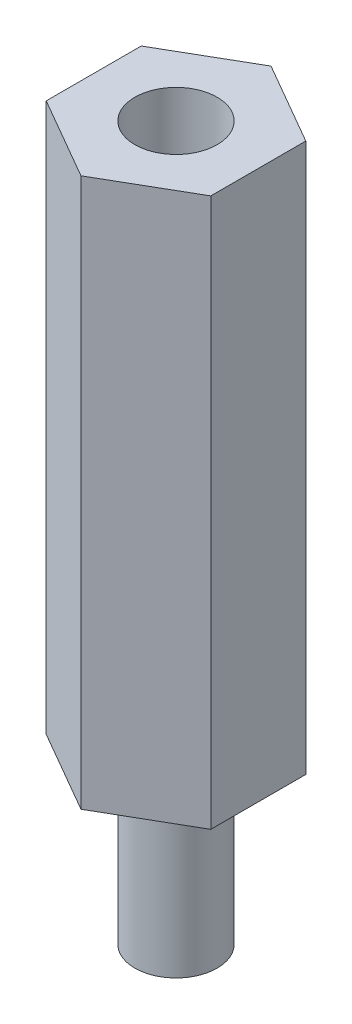
ISO-10303-21;
HEADER;
FILE_DESCRIPTION(('STEP AP214'),'2;1');
FILE_NAME('part.step','',(''),(''),'','','');
FILE_SCHEMA(('AUTOMOTIVE_DESIGN { 1 0 10303 214 1 1 1 1 }'));
ENDSEC;
DATA;
#1=APPLICATION_CONTEXT('core data for automotive mechanical design processes');
#2=APPLICATION_PROTOCOL_DEFINITION('international standard','automotive_design',2000,#1);
#3=PRODUCT_CONTEXT('',#1,'mechanical');
#4=PRODUCT('Part','Part','',(#3));
#5=PRODUCT_RELATED_PRODUCT_CATEGORY('part','',(#4));
#6=PRODUCT_DEFINITION_FORMATION('','',#4);
#7=PRODUCT_DEFINITION_CONTEXT('part definition',#1,'design');
#8=PRODUCT_DEFINITION('design','',#6,#7);
#9=PRODUCT_DEFINITION_SHAPE('','',#8);
#10=(LENGTH_UNIT() NAMED_UNIT(*) SI_UNIT(.MILLI.,.METRE.));
#11=(NAMED_UNIT(*) PLANE_ANGLE_UNIT() SI_UNIT($,.RADIAN.));
#12=(NAMED_UNIT(*) SI_UNIT($,.STERADIAN.) SOLID_ANGLE_UNIT());
#13=UNCERTAINTY_MEASURE_WITH_UNIT(LENGTH_MEASURE(1.E-05),#10,'distance_accuracy_value','');
#14=(GEOMETRIC_REPRESENTATION_CONTEXT(3) GLOBAL_UNCERTAINTY_ASSIGNED_CONTEXT((#13)) GLOBAL_UNIT_ASSIGNED_CONTEXT((#10,
#11,#12)) REPRESENTATION_CONTEXT('',''));
#15=CARTESIAN_POINT('',(0.,0.,0.));
#16=DIRECTION('',(0.,0.,1.));
#17=DIRECTION('',(1.,0.,0.));
#18=AXIS2_PLACEMENT_3D('',#15,#16,#17);
#19=CARTESIAN_POINT('',(0.,6.,0.));
#20=DIRECTION('',(0.,-1.,0.));
#21=DIRECTION('',(0.,0.,-1.));
#22=AXIS2_PLACEMENT_3D('',#19,#20,#21);
#23=CYLINDRICAL_SURFACE('',#22,1.5);
#24=CARTESIAN_POINT('',(0.,6.,0.));
#25=DIRECTION('',(0.,1.,0.));
#26=DIRECTION('',(0.,0.,1.));
#27=AXIS2_PLACEMENT_3D('',#24,#25,#26);
#28=CIRCLE('',#27,1.5);
#29=CARTESIAN_POINT('',(0.,6.,1.5));
#30=VERTEX_POINT('',#29);
#31=EDGE_CURVE('E11',#30,#30,#28,.T.);
#32=ORIENTED_EDGE('',*,*,#31,.F.);
#33=EDGE_LOOP('',(#32));
#34=FACE_BOUND('',#33,.T.);
#35=CARTESIAN_POINT('',(0.,0.,0.));
#36=DIRECTION('',(0.,1.,0.));
#37=DIRECTION('',(0.,0.,1.));
#38=AXIS2_PLACEMENT_3D('',#35,#36,#37);
#39=CIRCLE('',#38,1.5);
#40=CARTESIAN_POINT('',(0.,0.,1.5));
#41=VERTEX_POINT('',#40);
#42=EDGE_CURVE('E36',#41,#41,#39,.T.);
#43=ORIENTED_EDGE('',*,*,#42,.T.);
#44=EDGE_LOOP('',(#43));
#45=FACE_BOUND('',#44,.T.);
#46=ADVANCED_FACE('F33',(#34,#45),#23,.T.);
#47=CARTESIAN_POINT('',(0.,0.,0.));
#48=DIRECTION('',(0.,1.,0.));
#49=DIRECTION('',(0.,0.,1.));
#50=AXIS2_PLACEMENT_3D('',#47,#48,#49);
#51=PLANE('',#50);
#52=ORIENTED_EDGE('',*,*,#42,.F.);
#53=EDGE_LOOP('',(#52));
#54=FACE_BOUND('',#53,.T.);
#55=ADVANCED_FACE('F142',(#54),#51,.F.);
#56=CARTESIAN_POINT('',(-3.,26.,-1.73205080756888));
#57=DIRECTION('',(1.,0.,0.));
#58=DIRECTION('',(0.,0.,-1.));
#59=AXIS2_PLACEMENT_3D('',#56,#57,#58);
#60=PLANE('',#59);
#61=DIRECTION('',(0.,0.,1.));
#62=VECTOR('',#61,1.);
#63=CARTESIAN_POINT('',(-3.,6.,-1.73205080756888));
#64=LINE('',#63,#62);
#65=CARTESIAN_POINT('',(-3.,6.,-1.73205080756888));
#66=VERTEX_POINT('',#65);
#67=CARTESIAN_POINT('',(-3.,6.,1.73205080756888));
#68=VERTEX_POINT('',#67);
#69=EDGE_CURVE('E118',#66,#68,#64,.T.);
#70=ORIENTED_EDGE('',*,*,#69,.T.);
#71=DIRECTION('',(0.,-1.,0.));
#72=VECTOR('',#71,1.);
#73=CARTESIAN_POINT('',(-3.,26.,1.73205080756888));
#74=LINE('',#73,#72);
#75=CARTESIAN_POINT('',(-3.,26.,1.73205080756888));
#76=VERTEX_POINT('',#75);
#77=EDGE_CURVE('E136',#76,#68,#74,.T.);
#78=ORIENTED_EDGE('',*,*,#77,.F.);
#79=DIRECTION('',(0.,0.,1.));
#80=VECTOR('',#79,1.);
#81=CARTESIAN_POINT('',(-3.,26.,-1.73205080756888));
#82=LINE('',#81,#80);
#83=CARTESIAN_POINT('',(-3.,26.,-1.73205080756888));
#84=VERTEX_POINT('',#83);
#85=EDGE_CURVE('E129',#84,#76,#82,.T.);
#86=ORIENTED_EDGE('',*,*,#85,.F.);
#87=DIRECTION('',(0.,-1.,0.));
#88=VECTOR('',#87,1.);
#89=CARTESIAN_POINT('',(-3.,26.,-1.73205080756888));
#90=LINE('',#89,#88);
#91=EDGE_CURVE('E114',#84,#66,#90,.T.);
#92=ORIENTED_EDGE('',*,*,#91,.T.);
#93=EDGE_LOOP('',(#70,#78,#86,#92));
#94=FACE_BOUND('',#93,.T.);
#95=ADVANCED_FACE('F144',(#94),#60,.F.);
#96=CARTESIAN_POINT('',(-3.,26.,1.73205080756888));
#97=DIRECTION('',(0.5,0.,-0.866025403784438));
#98=DIRECTION('',(-0.866025403784438,0.,-0.5));
#99=AXIS2_PLACEMENT_3D('',#96,#97,#98);
#100=PLANE('',#99);
#101=DIRECTION('',(0.866025403784438,0.,0.5));
#102=VECTOR('',#101,1.);
#103=CARTESIAN_POINT('',(-3.,6.,1.73205080756888));
#104=LINE('',#103,#102);
#105=CARTESIAN_POINT('',(0.,6.,3.46410161513775));
#106=VERTEX_POINT('',#105);
#107=EDGE_CURVE('E121',#68,#106,#104,.T.);
#108=ORIENTED_EDGE('',*,*,#107,.T.);
#109=DIRECTION('',(0.,-1.,0.));
#110=VECTOR('',#109,1.);
#111=CARTESIAN_POINT('',(0.,26.,3.46410161513775));
#112=LINE('',#111,#110);
#113=CARTESIAN_POINT('',(0.,26.,3.46410161513775));
#114=VERTEX_POINT('',#113);
#115=EDGE_CURVE('E133',#114,#106,#112,.T.);
#116=ORIENTED_EDGE('',*,*,#115,.F.);
#117=DIRECTION('',(0.866025403784438,0.,0.5));
#118=VECTOR('',#117,1.);
#119=CARTESIAN_POINT('',(-3.,26.,1.73205080756888));
#120=LINE('',#119,#118);
#121=EDGE_CURVE('E87',#76,#114,#120,.T.);
#122=ORIENTED_EDGE('',*,*,#121,.F.);
#123=ORIENTED_EDGE('',*,*,#77,.T.);
#124=EDGE_LOOP('',(#108,#116,#122,#123));
#125=FACE_BOUND('',#124,.T.);
#126=ADVANCED_FACE('F149',(#125),#100,.F.);
#127=CARTESIAN_POINT('',(0.,26.,3.46410161513775));
#128=DIRECTION('',(-0.5,0.,-0.866025403784439));
#129=DIRECTION('',(-0.866025403784439,0.,0.5));
#130=AXIS2_PLACEMENT_3D('',#127,#128,#129);
#131=PLANE('',#130);
#132=DIRECTION('',(0.866025403784439,0.,-0.5));
#133=VECTOR('',#132,1.);
#134=CARTESIAN_POINT('',(0.,6.,3.46410161513775));
#135=LINE('',#134,#133);
#136=CARTESIAN_POINT('',(3.,6.,1.73205080756888));
#137=VERTEX_POINT('',#136);
#138=EDGE_CURVE('E124',#106,#137,#135,.T.);
#139=ORIENTED_EDGE('',*,*,#138,.T.);
#140=DIRECTION('',(0.,-1.,0.));
#141=VECTOR('',#140,1.);
#142=CARTESIAN_POINT('',(3.,26.,1.73205080756888));
#143=LINE('',#142,#141);
#144=CARTESIAN_POINT('',(3.,26.,1.73205080756888));
#145=VERTEX_POINT('',#144);
#146=EDGE_CURVE('E109',#145,#137,#143,.T.);
#147=ORIENTED_EDGE('',*,*,#146,.F.);
#148=DIRECTION('',(0.866025403784439,0.,-0.5));
#149=VECTOR('',#148,1.);
#150=CARTESIAN_POINT('',(0.,26.,3.46410161513775));
#151=LINE('',#150,#149);
#152=EDGE_CURVE('E100',#114,#145,#151,.T.);
#153=ORIENTED_EDGE('',*,*,#152,.F.);
#154=ORIENTED_EDGE('',*,*,#115,.T.);
#155=EDGE_LOOP('',(#139,#147,#153,#154));
#156=FACE_BOUND('',#155,.T.);
#157=ADVANCED_FACE('F156',(#156),#131,.F.);
#158=CARTESIAN_POINT('',(3.,26.,1.73205080756888));
#159=DIRECTION('',(-1.,0.,0.));
#160=DIRECTION('',(0.,0.,1.));
#161=AXIS2_PLACEMENT_3D('',#158,#159,#160);
#162=PLANE('',#161);
#163=DIRECTION('',(0.,0.,-1.));
#164=VECTOR('',#163,1.);
#165=CARTESIAN_POINT('',(3.,6.,1.73205080756888));
#166=LINE('',#165,#164);
#167=CARTESIAN_POINT('',(3.,6.,-1.73205080756888));
#168=VERTEX_POINT('',#167);
#169=EDGE_CURVE('E108',#137,#168,#166,.T.);
#170=ORIENTED_EDGE('',*,*,#169,.T.);
#171=DIRECTION('',(0.,-1.,0.));
#172=VECTOR('',#171,1.);
#173=CARTESIAN_POINT('',(3.,26.,-1.73205080756888));
#174=LINE('',#173,#172);
#175=CARTESIAN_POINT('',(3.,26.,-1.73205080756888));
#176=VERTEX_POINT('',#175);
#177=EDGE_CURVE('E105',#176,#168,#174,.T.);
#178=ORIENTED_EDGE('',*,*,#177,.F.);
#179=DIRECTION('',(0.,0.,-1.));
#180=VECTOR('',#179,1.);
#181=CARTESIAN_POINT('',(3.,26.,1.73205080756888));
#182=LINE('',#181,#180);
#183=EDGE_CURVE('E94',#145,#176,#182,.T.);
#184=ORIENTED_EDGE('',*,*,#183,.F.);
#185=ORIENTED_EDGE('',*,*,#146,.T.);
#186=EDGE_LOOP('',(#170,#178,#184,#185));
#187=FACE_BOUND('',#186,.T.);
#188=ADVANCED_FACE('F106',(#187),#162,.F.);
#189=CARTESIAN_POINT('',(3.,26.,-1.73205080756888));
#190=DIRECTION('',(-0.5,0.,0.866025403784438));
#191=DIRECTION('',(0.866025403784439,0.,0.5));
#192=AXIS2_PLACEMENT_3D('',#189,#190,#191);
#193=PLANE('',#192);
#194=DIRECTION('',(-0.866025403784439,0.,-0.5));
#195=VECTOR('',#194,1.);
#196=CARTESIAN_POINT('',(3.,6.,-1.73205080756888));
#197=LINE('',#196,#195);
#198=CARTESIAN_POINT('',(0.,6.,-3.46410161513775));
#199=VERTEX_POINT('',#198);
#200=EDGE_CURVE('E72',#168,#199,#197,.T.);
#201=ORIENTED_EDGE('',*,*,#200,.T.);
#202=DIRECTION('',(0.,-1.,0.));
#203=VECTOR('',#202,1.);
#204=CARTESIAN_POINT('',(0.,26.,-3.46410161513775));
#205=LINE('',#204,#203);
#206=CARTESIAN_POINT('',(0.,26.,-3.46410161513775));
#207=VERTEX_POINT('',#206);
#208=EDGE_CURVE('E110',#207,#199,#205,.T.);
#209=ORIENTED_EDGE('',*,*,#208,.F.);
#210=DIRECTION('',(-0.866025403784439,0.,-0.5));
#211=VECTOR('',#210,1.);
#212=CARTESIAN_POINT('',(3.,26.,-1.73205080756888));
#213=LINE('',#212,#211);
#214=EDGE_CURVE('E98',#176,#207,#213,.T.);
#215=ORIENTED_EDGE('',*,*,#214,.F.);
#216=ORIENTED_EDGE('',*,*,#177,.T.);
#217=EDGE_LOOP('',(#201,#209,#215,#216));
#218=FACE_BOUND('',#217,.T.);
#219=ADVANCED_FACE('F112',(#218),#193,.F.);
#220=CARTESIAN_POINT('',(0.,26.,-3.46410161513775));
#221=DIRECTION('',(0.5,0.,0.866025403784439));
#222=DIRECTION('',(0.866025403784439,0.,-0.5));
#223=AXIS2_PLACEMENT_3D('',#220,#221,#222);
#224=PLANE('',#223);
#225=DIRECTION('',(-0.866025403784439,0.,0.5));
#226=VECTOR('',#225,1.);
#227=CARTESIAN_POINT('',(0.,6.,-3.46410161513775));
#228=LINE('',#227,#226);
#229=EDGE_CURVE('E78',#199,#66,#228,.T.);
#230=ORIENTED_EDGE('',*,*,#229,.T.);
#231=ORIENTED_EDGE('',*,*,#91,.F.);
#232=DIRECTION('',(-0.866025403784439,0.,0.5));
#233=VECTOR('',#232,1.);
#234=CARTESIAN_POINT('',(0.,26.,-3.46410161513775));
#235=LINE('',#234,#233);
#236=EDGE_CURVE('E49',#207,#84,#235,.T.);
#237=ORIENTED_EDGE('',*,*,#236,.F.);
#238=ORIENTED_EDGE('',*,*,#208,.T.);
#239=EDGE_LOOP('',(#230,#231,#237,#238));
#240=FACE_BOUND('',#239,.T.);
#241=ADVANCED_FACE('F164',(#240),#224,.F.);
#242=CARTESIAN_POINT('',(0.,26.,0.));
#243=DIRECTION('',(0.,1.,0.));
#244=DIRECTION('',(0.,0.,1.));
#245=AXIS2_PLACEMENT_3D('',#242,#243,#244);
#246=PLANE('',#245);
#247=CARTESIAN_POINT('',(0.,26.,0.));
#248=DIRECTION('',(0.,1.,0.));
#249=DIRECTION('',(0.,0.,1.));
#250=AXIS2_PLACEMENT_3D('',#247,#248,#249);
#251=CIRCLE('',#250,1.5);
#252=CARTESIAN_POINT('',(0.,26.,1.5));
#253=VERTEX_POINT('',#252);
#254=EDGE_CURVE('E185',#253,#253,#251,.T.);
#255=ORIENTED_EDGE('',*,*,#254,.F.);
#256=EDGE_LOOP('',(#255));
#257=FACE_BOUND('',#256,.T.);
#258=ORIENTED_EDGE('',*,*,#85,.T.);
#259=ORIENTED_EDGE('',*,*,#121,.T.);
#260=ORIENTED_EDGE('',*,*,#152,.T.);
#261=ORIENTED_EDGE('',*,*,#183,.T.);
#262=ORIENTED_EDGE('',*,*,#214,.T.);
#263=ORIENTED_EDGE('',*,*,#236,.T.);
#264=EDGE_LOOP('',(#258,#259,#260,#261,#262,#263));
#265=FACE_BOUND('',#264,.T.);
#266=ADVANCED_FACE('F96',(#257,#265),#246,.T.);
#267=CARTESIAN_POINT('',(0.,6.,0.));
#268=DIRECTION('',(0.,1.,0.));
#269=DIRECTION('',(0.,0.,1.));
#270=AXIS2_PLACEMENT_3D('',#267,#268,#269);
#271=PLANE('',#270);
#272=ORIENTED_EDGE('',*,*,#31,.T.);
#273=EDGE_LOOP('',(#272));
#274=FACE_BOUND('',#273,.T.);
#275=ORIENTED_EDGE('',*,*,#69,.F.);
#276=ORIENTED_EDGE('',*,*,#229,.F.);
#277=ORIENTED_EDGE('',*,*,#200,.F.);
#278=ORIENTED_EDGE('',*,*,#169,.F.);
#279=ORIENTED_EDGE('',*,*,#138,.F.);
#280=ORIENTED_EDGE('',*,*,#107,.F.);
#281=EDGE_LOOP('',(#275,#276,#277,#278,#279,#280));
#282=FACE_BOUND('',#281,.T.);
#283=ADVANCED_FACE('F167',(#274,#282),#271,.F.);
#284=CARTESIAN_POINT('',(0.,20.,0.));
#285=DIRECTION('',(0.,1.,0.));
#286=DIRECTION('',(0.,0.,1.));
#287=AXIS2_PLACEMENT_3D('',#284,#285,#286);
#288=CYLINDRICAL_SURFACE('',#287,1.5);
#289=CARTESIAN_POINT('',(0.,20.,0.));
#290=DIRECTION('',(0.,1.,0.));
#291=DIRECTION('',(0.,0.,1.));
#292=AXIS2_PLACEMENT_3D('',#289,#290,#291);
#293=CIRCLE('',#292,1.5);
#294=CARTESIAN_POINT('',(0.,20.,1.5));
#295=VERTEX_POINT('',#294);
#296=EDGE_CURVE('E122',#295,#295,#293,.T.);
#297=ORIENTED_EDGE('',*,*,#296,.F.);
#298=EDGE_LOOP('',(#297));
#299=FACE_BOUND('',#298,.T.);
#300=ORIENTED_EDGE('',*,*,#254,.T.);
#301=EDGE_LOOP('',(#300));
#302=FACE_BOUND('',#301,.T.);
#303=ADVANCED_FACE('F170',(#299,#302),#288,.F.);
#304=CARTESIAN_POINT('',(0.,20.,0.));
#305=DIRECTION('',(0.,1.,0.));
#306=DIRECTION('',(0.,0.,1.));
#307=AXIS2_PLACEMENT_3D('',#304,#305,#306);
#308=PLANE('',#307);
#309=ORIENTED_EDGE('',*,*,#296,.T.);
#310=EDGE_LOOP('',(#309));
#311=FACE_BOUND('',#310,.T.);
#312=ADVANCED_FACE('F177',(#311),#308,.T.);
#313=CLOSED_SHELL('',(#46,#55,#95,#126,#157,#188,#219,#241,#266,#283,#303,#312));
#314=MANIFOLD_SOLID_BREP('B2',#313);
#315=ADVANCED_BREP_SHAPE_REPRESENTATION('',(#18,#314),#14);
#316=SHAPE_DEFINITION_REPRESENTATION(#9,#315);
ENDSEC;
END-ISO-10303-21;
